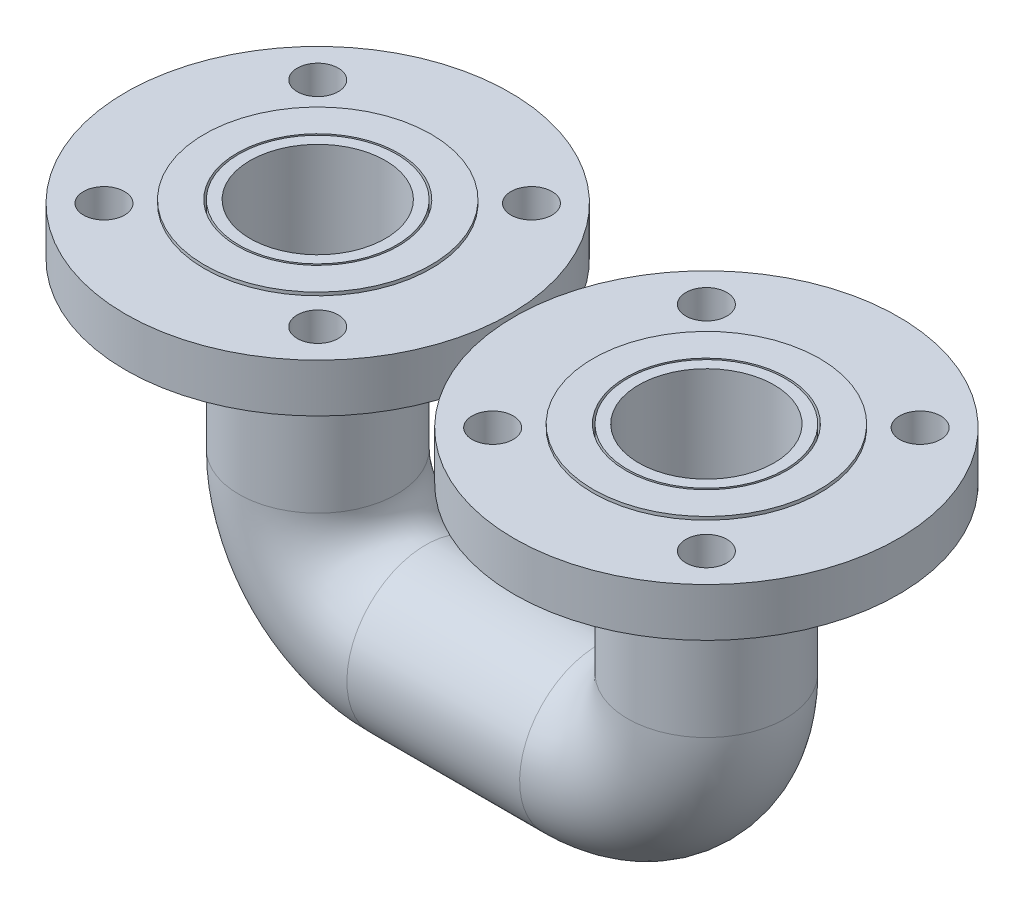
ISO-10303-21;
HEADER;
FILE_DESCRIPTION(('STEP AP214'),'2;1');
FILE_NAME('part.step','',(''),(''),'','','');
FILE_SCHEMA(('AUTOMOTIVE_DESIGN { 1 0 10303 214 1 1 1 1 }'));
ENDSEC;
DATA;
#1=APPLICATION_CONTEXT('core data for automotive mechanical design processes');
#2=APPLICATION_PROTOCOL_DEFINITION('international standard','automotive_design',2000,#1);
#3=PRODUCT_CONTEXT('',#1,'mechanical');
#4=PRODUCT('Part','Part','',(#3));
#5=PRODUCT_RELATED_PRODUCT_CATEGORY('part','',(#4));
#6=PRODUCT_DEFINITION_FORMATION('','',#4);
#7=PRODUCT_DEFINITION_CONTEXT('part definition',#1,'design');
#8=PRODUCT_DEFINITION('design','',#6,#7);
#9=PRODUCT_DEFINITION_SHAPE('','',#8);
#10=(LENGTH_UNIT() NAMED_UNIT(*) SI_UNIT(.MILLI.,.METRE.));
#11=(NAMED_UNIT(*) PLANE_ANGLE_UNIT() SI_UNIT($,.RADIAN.));
#12=(NAMED_UNIT(*) SI_UNIT($,.STERADIAN.) SOLID_ANGLE_UNIT());
#13=UNCERTAINTY_MEASURE_WITH_UNIT(LENGTH_MEASURE(1.E-05),#10,'distance_accuracy_value','');
#14=(GEOMETRIC_REPRESENTATION_CONTEXT(3) GLOBAL_UNCERTAINTY_ASSIGNED_CONTEXT((#13)) GLOBAL_UNIT_ASSIGNED_CONTEXT((#10,
#11,#12)) REPRESENTATION_CONTEXT('',''));
#15=CARTESIAN_POINT('',(0.,0.,0.));
#16=DIRECTION('',(0.,0.,1.));
#17=DIRECTION('',(1.,0.,0.));
#18=AXIS2_PLACEMENT_3D('',#15,#16,#17);
#19=CARTESIAN_POINT('',(180.,-76.1,0.));
#20=DIRECTION('',(0.,1.,0.));
#21=DIRECTION('',(0.,0.,1.));
#22=AXIS2_PLACEMENT_3D('',#19,#20,#21);
#23=CYLINDRICAL_SURFACE('',#22,36.5);
#24=CARTESIAN_POINT('',(180.,-76.1,0.));
#25=DIRECTION('',(0.,-1.,0.));
#26=DIRECTION('',(1.,0.,0.));
#27=AXIS2_PLACEMENT_3D('',#24,#25,#26);
#28=CIRCLE('',#27,36.5);
#29=CARTESIAN_POINT('',(216.5,-76.1,0.));
#30=VERTEX_POINT('',#29);
#31=EDGE_CURVE('E52',#30,#30,#28,.T.);
#32=ORIENTED_EDGE('',*,*,#31,.F.);
#33=EDGE_LOOP('',(#32));
#34=FACE_BOUND('',#33,.T.);
#35=CARTESIAN_POINT('',(180.,23.9,0.));
#36=DIRECTION('',(0.,-1.,0.));
#37=DIRECTION('',(1.,0.,0.));
#38=AXIS2_PLACEMENT_3D('',#35,#36,#37);
#39=CIRCLE('',#38,36.5);
#40=CARTESIAN_POINT('',(216.5,23.9,0.));
#41=VERTEX_POINT('',#40);
#42=EDGE_CURVE('E11',#41,#41,#39,.T.);
#43=ORIENTED_EDGE('',*,*,#42,.T.);
#44=EDGE_LOOP('',(#43));
#45=FACE_BOUND('',#44,.T.);
#46=ADVANCED_FACE('F42',(#34,#45),#23,.T.);
#47=CARTESIAN_POINT('',(180.,-76.1,0.));
#48=DIRECTION('',(0.,1.,0.));
#49=DIRECTION('',(0.,0.,1.));
#50=AXIS2_PLACEMENT_3D('',#47,#48,#49);
#51=CYLINDRICAL_SURFACE('',#50,31.34);
#52=CARTESIAN_POINT('',(180.,-76.1,0.));
#53=DIRECTION('',(0.,-1.,0.));
#54=DIRECTION('',(1.,0.,0.));
#55=AXIS2_PLACEMENT_3D('',#52,#53,#54);
#56=CIRCLE('',#55,31.34);
#57=CARTESIAN_POINT('',(211.34,-76.1,0.));
#58=VERTEX_POINT('',#57);
#59=EDGE_CURVE('E56',#58,#58,#56,.T.);
#60=ORIENTED_EDGE('',*,*,#59,.T.);
#61=EDGE_LOOP('',(#60));
#62=FACE_BOUND('',#61,.T.);
#63=CARTESIAN_POINT('',(180.,23.9,0.));
#64=DIRECTION('',(0.,-1.,0.));
#65=DIRECTION('',(1.,0.,0.));
#66=AXIS2_PLACEMENT_3D('',#63,#64,#65);
#67=CIRCLE('',#66,31.34);
#68=CARTESIAN_POINT('',(211.34,23.9,0.));
#69=VERTEX_POINT('',#68);
#70=EDGE_CURVE('E48',#69,#69,#67,.T.);
#71=ORIENTED_EDGE('',*,*,#70,.F.);
#72=EDGE_LOOP('',(#71));
#73=FACE_BOUND('',#72,.T.);
#74=ADVANCED_FACE('F111',(#62,#73),#51,.F.);
#75=CARTESIAN_POINT('',(130.,-76.1,0.));
#76=DIRECTION('',(0.,0.,1.));
#77=DIRECTION('',(1.,0.,0.));
#78=AXIS2_PLACEMENT_3D('',#75,#76,#77);
#79=TOROIDAL_SURFACE('',#78,50.,36.5);
#80=CARTESIAN_POINT('',(130.,-126.1,0.));
#81=DIRECTION('',(-1.,0.,0.));
#82=DIRECTION('',(0.,-1.,0.));
#83=AXIS2_PLACEMENT_3D('',#80,#81,#82);
#84=CIRCLE('',#83,36.5);
#85=CARTESIAN_POINT('',(130.,-162.6,0.));
#86=VERTEX_POINT('',#85);
#87=EDGE_CURVE('E61',#86,#86,#84,.T.);
#88=CARTESIAN_POINT('',(130.,-76.1,0.));
#89=DIRECTION('',(0.,0.,1.));
#90=DIRECTION('',(1.,0.,0.));
#91=AXIS2_PLACEMENT_3D('',#88,#89,#90);
#92=CIRCLE('',#91,86.5);
#93=EDGE_CURVE('',#86,#30,#92,.T.);
#94=ORIENTED_EDGE('',*,*,#87,.F.);
#95=ORIENTED_EDGE('',*,*,#31,.T.);
#96=ORIENTED_EDGE('',*,*,#93,.T.);
#97=ORIENTED_EDGE('',*,*,#93,.F.);
#98=EDGE_LOOP('',(#94,#96,#95,#97));
#99=FACE_BOUND('',#98,.T.);
#100=ADVANCED_FACE('F116',(#99),#79,.T.);
#101=CARTESIAN_POINT('',(130.,-76.1,0.));
#102=DIRECTION('',(0.,0.,1.));
#103=DIRECTION('',(1.,0.,0.));
#104=AXIS2_PLACEMENT_3D('',#101,#102,#103);
#105=TOROIDAL_SURFACE('',#104,50.,31.34);
#106=CARTESIAN_POINT('',(130.,-126.1,0.));
#107=DIRECTION('',(-1.,0.,0.));
#108=DIRECTION('',(0.,-1.,0.));
#109=AXIS2_PLACEMENT_3D('',#106,#107,#108);
#110=CIRCLE('',#109,31.34);
#111=CARTESIAN_POINT('',(130.,-157.44,0.));
#112=VERTEX_POINT('',#111);
#113=EDGE_CURVE('E64',#112,#112,#110,.T.);
#114=CARTESIAN_POINT('',(130.,-76.1,0.));
#115=DIRECTION('',(0.,0.,1.));
#116=DIRECTION('',(1.,0.,0.));
#117=AXIS2_PLACEMENT_3D('',#114,#115,#116);
#118=CIRCLE('',#117,81.34);
#119=EDGE_CURVE('',#112,#58,#118,.T.);
#120=ORIENTED_EDGE('',*,*,#113,.T.);
#121=ORIENTED_EDGE('',*,*,#59,.F.);
#122=ORIENTED_EDGE('',*,*,#119,.T.);
#123=ORIENTED_EDGE('',*,*,#119,.F.);
#124=EDGE_LOOP('',(#120,#122,#121,#123));
#125=FACE_BOUND('',#124,.T.);
#126=ADVANCED_FACE('F121',(#125),#105,.F.);
#127=CARTESIAN_POINT('',(50.,-126.1,0.));
#128=DIRECTION('',(1.,0.,0.));
#129=DIRECTION('',(0.,0.,-1.));
#130=AXIS2_PLACEMENT_3D('',#127,#128,#129);
#131=CYLINDRICAL_SURFACE('',#130,36.5);
#132=CARTESIAN_POINT('',(50.,-126.1,0.));
#133=DIRECTION('',(-1.,0.,0.));
#134=DIRECTION('',(0.,-1.,0.));
#135=AXIS2_PLACEMENT_3D('',#132,#133,#134);
#136=CIRCLE('',#135,36.5);
#137=CARTESIAN_POINT('',(50.,-162.6,0.));
#138=VERTEX_POINT('',#137);
#139=EDGE_CURVE('E67',#138,#138,#136,.T.);
#140=ORIENTED_EDGE('',*,*,#139,.F.);
#141=EDGE_LOOP('',(#140));
#142=FACE_BOUND('',#141,.T.);
#143=ORIENTED_EDGE('',*,*,#87,.T.);
#144=EDGE_LOOP('',(#143));
#145=FACE_BOUND('',#144,.T.);
#146=ADVANCED_FACE('F127',(#142,#145),#131,.T.);
#147=CARTESIAN_POINT('',(50.,-126.1,0.));
#148=DIRECTION('',(1.,0.,0.));
#149=DIRECTION('',(0.,0.,-1.));
#150=AXIS2_PLACEMENT_3D('',#147,#148,#149);
#151=CYLINDRICAL_SURFACE('',#150,31.34);
#152=CARTESIAN_POINT('',(50.,-126.1,0.));
#153=DIRECTION('',(-1.,0.,0.));
#154=DIRECTION('',(0.,-1.,0.));
#155=AXIS2_PLACEMENT_3D('',#152,#153,#154);
#156=CIRCLE('',#155,31.34);
#157=CARTESIAN_POINT('',(50.,-157.44,0.));
#158=VERTEX_POINT('',#157);
#159=EDGE_CURVE('E70',#158,#158,#156,.T.);
#160=ORIENTED_EDGE('',*,*,#159,.T.);
#161=EDGE_LOOP('',(#160));
#162=FACE_BOUND('',#161,.T.);
#163=ORIENTED_EDGE('',*,*,#113,.F.);
#164=EDGE_LOOP('',(#163));
#165=FACE_BOUND('',#164,.T.);
#166=ADVANCED_FACE('F134',(#162,#165),#151,.F.);
#167=CARTESIAN_POINT('',(50.,-76.1,0.));
#168=DIRECTION('',(0.,0.,1.));
#169=DIRECTION('',(1.,0.,0.));
#170=AXIS2_PLACEMENT_3D('',#167,#168,#169);
#171=TOROIDAL_SURFACE('',#170,50.,36.5);
#172=CARTESIAN_POINT('',(0.,-76.1,0.));
#173=DIRECTION('',(0.,1.,0.));
#174=DIRECTION('',(-1.,0.,0.));
#175=AXIS2_PLACEMENT_3D('',#172,#173,#174);
#176=CIRCLE('',#175,36.5);
#177=CARTESIAN_POINT('',(-36.5,-76.1,0.));
#178=VERTEX_POINT('',#177);
#179=EDGE_CURVE('E73',#178,#178,#176,.T.);
#180=CARTESIAN_POINT('',(50.,-76.1,0.));
#181=DIRECTION('',(0.,0.,1.));
#182=DIRECTION('',(1.,0.,0.));
#183=AXIS2_PLACEMENT_3D('',#180,#181,#182);
#184=CIRCLE('',#183,86.5);
#185=EDGE_CURVE('',#178,#138,#184,.T.);
#186=ORIENTED_EDGE('',*,*,#179,.F.);
#187=ORIENTED_EDGE('',*,*,#139,.T.);
#188=ORIENTED_EDGE('',*,*,#185,.T.);
#189=ORIENTED_EDGE('',*,*,#185,.F.);
#190=EDGE_LOOP('',(#186,#188,#187,#189));
#191=FACE_BOUND('',#190,.T.);
#192=ADVANCED_FACE('F138',(#191),#171,.T.);
#193=CARTESIAN_POINT('',(50.,-76.1,0.));
#194=DIRECTION('',(0.,0.,1.));
#195=DIRECTION('',(1.,0.,0.));
#196=AXIS2_PLACEMENT_3D('',#193,#194,#195);
#197=TOROIDAL_SURFACE('',#196,50.,31.34);
#198=CARTESIAN_POINT('',(0.,-76.1,0.));
#199=DIRECTION('',(0.,1.,0.));
#200=DIRECTION('',(-1.,0.,0.));
#201=AXIS2_PLACEMENT_3D('',#198,#199,#200);
#202=CIRCLE('',#201,31.34);
#203=CARTESIAN_POINT('',(-31.34,-76.1,0.));
#204=VERTEX_POINT('',#203);
#205=EDGE_CURVE('E77',#204,#204,#202,.T.);
#206=CARTESIAN_POINT('',(50.,-76.1,0.));
#207=DIRECTION('',(0.,0.,1.));
#208=DIRECTION('',(1.,0.,0.));
#209=AXIS2_PLACEMENT_3D('',#206,#207,#208);
#210=CIRCLE('',#209,81.34);
#211=EDGE_CURVE('',#204,#158,#210,.T.);
#212=ORIENTED_EDGE('',*,*,#205,.T.);
#213=ORIENTED_EDGE('',*,*,#159,.F.);
#214=ORIENTED_EDGE('',*,*,#211,.T.);
#215=ORIENTED_EDGE('',*,*,#211,.F.);
#216=EDGE_LOOP('',(#212,#214,#213,#215));
#217=FACE_BOUND('',#216,.T.);
#218=ADVANCED_FACE('F86',(#217),#197,.F.);
#219=CARTESIAN_POINT('',(0.,-76.1,0.));
#220=DIRECTION('',(0.,1.,0.));
#221=DIRECTION('',(0.,0.,1.));
#222=AXIS2_PLACEMENT_3D('',#219,#220,#221);
#223=CYLINDRICAL_SURFACE('',#222,31.34);
#224=ORIENTED_EDGE('',*,*,#205,.F.);
#225=EDGE_LOOP('',(#224));
#226=FACE_BOUND('',#225,.T.);
#227=CARTESIAN_POINT('',(0.,23.9,0.));
#228=DIRECTION('',(0.,1.,0.));
#229=DIRECTION('',(-1.,0.,0.));
#230=AXIS2_PLACEMENT_3D('',#227,#228,#229);
#231=CIRCLE('',#230,31.34);
#232=CARTESIAN_POINT('',(-31.34,23.9,0.));
#233=VERTEX_POINT('',#232);
#234=EDGE_CURVE('E78',#233,#233,#231,.T.);
#235=ORIENTED_EDGE('',*,*,#234,.T.);
#236=EDGE_LOOP('',(#235));
#237=FACE_BOUND('',#236,.T.);
#238=ADVANCED_FACE('F89',(#226,#237),#223,.F.);
#239=CARTESIAN_POINT('',(0.,-76.1,0.));
#240=DIRECTION('',(0.,1.,0.));
#241=DIRECTION('',(0.,0.,1.));
#242=AXIS2_PLACEMENT_3D('',#239,#240,#241);
#243=CYLINDRICAL_SURFACE('',#242,36.5);
#244=ORIENTED_EDGE('',*,*,#179,.T.);
#245=EDGE_LOOP('',(#244));
#246=FACE_BOUND('',#245,.T.);
#247=CARTESIAN_POINT('',(0.,23.9,0.));
#248=DIRECTION('',(0.,1.,0.));
#249=DIRECTION('',(-1.,0.,0.));
#250=AXIS2_PLACEMENT_3D('',#247,#248,#249);
#251=CIRCLE('',#250,36.5);
#252=CARTESIAN_POINT('',(-36.5,23.9,0.));
#253=VERTEX_POINT('',#252);
#254=EDGE_CURVE('E74',#253,#253,#251,.T.);
#255=ORIENTED_EDGE('',*,*,#254,.F.);
#256=EDGE_LOOP('',(#255));
#257=FACE_BOUND('',#256,.T.);
#258=ADVANCED_FACE('F92',(#246,#257),#243,.T.);
#259=CARTESIAN_POINT('',(180.,23.9,0.));
#260=DIRECTION('',(0.,-1.,0.));
#261=DIRECTION('',(1.,0.,0.));
#262=AXIS2_PLACEMENT_3D('',#259,#260,#261);
#263=PLANE('',#262);
#264=ORIENTED_EDGE('',*,*,#70,.T.);
#265=EDGE_LOOP('',(#264));
#266=FACE_BOUND('',#265,.T.);
#267=ORIENTED_EDGE('',*,*,#42,.F.);
#268=EDGE_LOOP('',(#267));
#269=FACE_BOUND('',#268,.T.);
#270=ADVANCED_FACE('F99',(#266,#269),#263,.F.);
#271=CARTESIAN_POINT('',(0.,23.9,0.));
#272=DIRECTION('',(0.,1.,0.));
#273=DIRECTION('',(-1.,0.,0.));
#274=AXIS2_PLACEMENT_3D('',#271,#272,#273);
#275=PLANE('',#274);
#276=ORIENTED_EDGE('',*,*,#234,.F.);
#277=EDGE_LOOP('',(#276));
#278=FACE_BOUND('',#277,.T.);
#279=ORIENTED_EDGE('',*,*,#254,.T.);
#280=EDGE_LOOP('',(#279));
#281=FACE_BOUND('',#280,.T.);
#282=ADVANCED_FACE('F96',(#278,#281),#275,.T.);
#283=CLOSED_SHELL('',(#46,#74,#100,#126,#146,#166,#192,#218,#238,#258,#270,#282));
#284=MANIFOLD_SOLID_BREP('B2',#283);
#285=CARTESIAN_POINT('',(180.,22.4,0.));
#286=DIRECTION('',(0.,1.,0.));
#287=DIRECTION('',(0.,0.,1.));
#288=AXIS2_PLACEMENT_3D('',#285,#286,#287);
#289=PLANE('',#288);
#290=CARTESIAN_POINT('',(130.502525316942,22.4,-49.4974746830582));
#291=DIRECTION('',(0.,-1.,0.));
#292=DIRECTION('',(0.,0.,-1.));
#293=AXIS2_PLACEMENT_3D('',#290,#291,#292);
#294=CIRCLE('',#293,9.5);
#295=CARTESIAN_POINT('',(130.502525316942,22.4,-58.9974746830582));
#296=VERTEX_POINT('',#295);
#297=EDGE_CURVE('E262',#296,#296,#294,.T.);
#298=ORIENTED_EDGE('',*,*,#297,.T.);
#299=EDGE_LOOP('',(#298));
#300=FACE_BOUND('',#299,.T.);
#301=CARTESIAN_POINT('',(229.497474683058,22.4,49.4974746830582));
#302=DIRECTION('',(0.,-1.,0.));
#303=DIRECTION('',(0.,0.,-1.));
#304=AXIS2_PLACEMENT_3D('',#301,#302,#303);
#305=CIRCLE('',#304,9.5);
#306=CARTESIAN_POINT('',(229.497474683058,22.4,39.9974746830582));
#307=VERTEX_POINT('',#306);
#308=EDGE_CURVE('E250',#307,#307,#305,.T.);
#309=ORIENTED_EDGE('',*,*,#308,.T.);
#310=EDGE_LOOP('',(#309));
#311=FACE_BOUND('',#310,.T.);
#312=CARTESIAN_POINT('',(180.,22.4,0.));
#313=DIRECTION('',(0.,-1.,0.));
#314=DIRECTION('',(0.,0.,1.));
#315=AXIS2_PLACEMENT_3D('',#312,#313,#314);
#316=CIRCLE('',#315,89.);
#317=CARTESIAN_POINT('',(180.,22.4,89.));
#318=VERTEX_POINT('',#317);
#319=EDGE_CURVE('E41',#318,#318,#316,.T.);
#320=ORIENTED_EDGE('',*,*,#319,.F.);
#321=EDGE_LOOP('',(#320));
#322=FACE_BOUND('',#321,.T.);
#323=CARTESIAN_POINT('',(229.497474683058,22.4,-49.4974746830582));
#324=DIRECTION('',(0.,-1.,0.));
#325=DIRECTION('',(0.,0.,1.));
#326=AXIS2_PLACEMENT_3D('',#323,#324,#325);
#327=CIRCLE('',#326,9.5);
#328=CARTESIAN_POINT('',(229.497474683058,22.4,-39.9974746830582));
#329=VERTEX_POINT('',#328);
#330=EDGE_CURVE('E246',#329,#329,#327,.T.);
#331=ORIENTED_EDGE('',*,*,#330,.T.);
#332=EDGE_LOOP('',(#331));
#333=FACE_BOUND('',#332,.T.);
#334=CARTESIAN_POINT('',(130.502525316942,22.4,49.4974746830582));
#335=DIRECTION('',(0.,-1.,0.));
#336=DIRECTION('',(0.,0.,1.));
#337=AXIS2_PLACEMENT_3D('',#334,#335,#336);
#338=CIRCLE('',#337,9.5);
#339=CARTESIAN_POINT('',(130.502525316942,22.4,58.9974746830582));
#340=VERTEX_POINT('',#339);
#341=EDGE_CURVE('E256',#340,#340,#338,.T.);
#342=ORIENTED_EDGE('',*,*,#341,.T.);
#343=EDGE_LOOP('',(#342));
#344=FACE_BOUND('',#343,.T.);
#345=CARTESIAN_POINT('',(180.,22.4,0.));
#346=DIRECTION('',(0.,-1.,0.));
#347=DIRECTION('',(0.,0.,1.));
#348=AXIS2_PLACEMENT_3D('',#345,#346,#347);
#349=CIRCLE('',#348,52.5);
#350=CARTESIAN_POINT('',(180.,22.4,52.5));
#351=VERTEX_POINT('',#350);
#352=EDGE_CURVE('E271',#351,#351,#349,.T.);
#353=ORIENTED_EDGE('',*,*,#352,.T.);
#354=EDGE_LOOP('',(#353));
#355=FACE_BOUND('',#354,.T.);
#356=ADVANCED_FACE('F231',(#300,#311,#322,#333,#344,#355),#289,.T.);
#357=CARTESIAN_POINT('',(180.,0.,0.));
#358=DIRECTION('',(0.,1.,0.));
#359=DIRECTION('',(0.,0.,1.));
#360=AXIS2_PLACEMENT_3D('',#357,#358,#359);
#361=PLANE('',#360);
#362=CARTESIAN_POINT('',(180.,0.,0.));
#363=DIRECTION('',(0.,-1.,0.));
#364=DIRECTION('',(0.,0.,1.));
#365=AXIS2_PLACEMENT_3D('',#362,#363,#364);
#366=CIRCLE('',#365,89.);
#367=CARTESIAN_POINT('',(180.,0.,89.));
#368=VERTEX_POINT('',#367);
#369=EDGE_CURVE('E235',#368,#368,#366,.T.);
#370=ORIENTED_EDGE('',*,*,#369,.T.);
#371=EDGE_LOOP('',(#370));
#372=FACE_BOUND('',#371,.T.);
#373=CARTESIAN_POINT('',(180.,0.,0.));
#374=DIRECTION('',(0.,-1.,0.));
#375=DIRECTION('',(0.,0.,1.));
#376=AXIS2_PLACEMENT_3D('',#373,#374,#375);
#377=CIRCLE('',#376,37.35);
#378=CARTESIAN_POINT('',(180.,0.,37.35));
#379=VERTEX_POINT('',#378);
#380=EDGE_CURVE('E242',#379,#379,#377,.T.);
#381=ORIENTED_EDGE('',*,*,#380,.F.);
#382=EDGE_LOOP('',(#381));
#383=FACE_BOUND('',#382,.T.);
#384=CARTESIAN_POINT('',(229.497474683058,0.,-49.4974746830582));
#385=DIRECTION('',(0.,-1.,0.));
#386=DIRECTION('',(0.,0.,1.));
#387=AXIS2_PLACEMENT_3D('',#384,#385,#386);
#388=CIRCLE('',#387,9.5);
#389=CARTESIAN_POINT('',(229.497474683058,0.,-39.9974746830582));
#390=VERTEX_POINT('',#389);
#391=EDGE_CURVE('E247',#390,#390,#388,.T.);
#392=ORIENTED_EDGE('',*,*,#391,.F.);
#393=EDGE_LOOP('',(#392));
#394=FACE_BOUND('',#393,.T.);
#395=CARTESIAN_POINT('',(229.497474683058,0.,49.4974746830582));
#396=DIRECTION('',(0.,-1.,0.));
#397=DIRECTION('',(0.,0.,-1.));
#398=AXIS2_PLACEMENT_3D('',#395,#396,#397);
#399=CIRCLE('',#398,9.5);
#400=CARTESIAN_POINT('',(229.497474683058,0.,39.9974746830582));
#401=VERTEX_POINT('',#400);
#402=EDGE_CURVE('E253',#401,#401,#399,.T.);
#403=ORIENTED_EDGE('',*,*,#402,.F.);
#404=EDGE_LOOP('',(#403));
#405=FACE_BOUND('',#404,.T.);
#406=CARTESIAN_POINT('',(130.502525316942,0.,49.4974746830582));
#407=DIRECTION('',(0.,-1.,0.));
#408=DIRECTION('',(0.,0.,1.));
#409=AXIS2_PLACEMENT_3D('',#406,#407,#408);
#410=CIRCLE('',#409,9.5);
#411=CARTESIAN_POINT('',(130.502525316942,0.,58.9974746830582));
#412=VERTEX_POINT('',#411);
#413=EDGE_CURVE('E259',#412,#412,#410,.T.);
#414=ORIENTED_EDGE('',*,*,#413,.F.);
#415=EDGE_LOOP('',(#414));
#416=FACE_BOUND('',#415,.T.);
#417=CARTESIAN_POINT('',(130.502525316942,0.,-49.4974746830582));
#418=DIRECTION('',(0.,-1.,0.));
#419=DIRECTION('',(0.,0.,-1.));
#420=AXIS2_PLACEMENT_3D('',#417,#418,#419);
#421=CIRCLE('',#420,9.5);
#422=CARTESIAN_POINT('',(130.502525316942,0.,-58.9974746830582));
#423=VERTEX_POINT('',#422);
#424=EDGE_CURVE('E265',#423,#423,#421,.T.);
#425=ORIENTED_EDGE('',*,*,#424,.F.);
#426=EDGE_LOOP('',(#425));
#427=FACE_BOUND('',#426,.T.);
#428=ADVANCED_FACE('F294',(#372,#383,#394,#405,#416,#427),#361,.F.);
#429=CARTESIAN_POINT('',(180.,22.4,0.));
#430=DIRECTION('',(0.,-1.,0.));
#431=DIRECTION('',(0.,0.,-1.));
#432=AXIS2_PLACEMENT_3D('',#429,#430,#431);
#433=CYLINDRICAL_SURFACE('',#432,89.);
#434=ORIENTED_EDGE('',*,*,#319,.T.);
#435=EDGE_LOOP('',(#434));
#436=FACE_BOUND('',#435,.T.);
#437=ORIENTED_EDGE('',*,*,#369,.F.);
#438=EDGE_LOOP('',(#437));
#439=FACE_BOUND('',#438,.T.);
#440=ADVANCED_FACE('F233',(#436,#439),#433,.T.);
#441=CARTESIAN_POINT('',(180.,22.4,0.));
#442=DIRECTION('',(0.,-1.,0.));
#443=DIRECTION('',(0.,0.,-1.));
#444=AXIS2_PLACEMENT_3D('',#441,#442,#443);
#445=CYLINDRICAL_SURFACE('',#444,37.35);
#446=ORIENTED_EDGE('',*,*,#380,.T.);
#447=EDGE_LOOP('',(#446));
#448=FACE_BOUND('',#447,.T.);
#449=CARTESIAN_POINT('',(180.,23.9,0.));
#450=DIRECTION('',(0.,-1.,0.));
#451=DIRECTION('',(0.,0.,1.));
#452=AXIS2_PLACEMENT_3D('',#449,#450,#451);
#453=CIRCLE('',#452,37.35);
#454=CARTESIAN_POINT('',(180.,23.9,37.35));
#455=VERTEX_POINT('',#454);
#456=EDGE_CURVE('E274',#455,#455,#453,.T.);
#457=ORIENTED_EDGE('',*,*,#456,.F.);
#458=EDGE_LOOP('',(#457));
#459=FACE_BOUND('',#458,.T.);
#460=ADVANCED_FACE('F282',(#448,#459),#445,.F.);
#461=CARTESIAN_POINT('',(229.497474683058,22.4,-49.4974746830582));
#462=DIRECTION('',(0.,-1.,0.));
#463=DIRECTION('',(0.,0.,-1.));
#464=AXIS2_PLACEMENT_3D('',#461,#462,#463);
#465=CYLINDRICAL_SURFACE('',#464,9.5);
#466=ORIENTED_EDGE('',*,*,#330,.F.);
#467=EDGE_LOOP('',(#466));
#468=FACE_BOUND('',#467,.T.);
#469=ORIENTED_EDGE('',*,*,#391,.T.);
#470=EDGE_LOOP('',(#469));
#471=FACE_BOUND('',#470,.T.);
#472=ADVANCED_FACE('F284',(#468,#471),#465,.F.);
#473=CARTESIAN_POINT('',(229.497474683058,22.4,49.4974746830582));
#474=DIRECTION('',(0.,-1.,0.));
#475=DIRECTION('',(0.,0.,-1.));
#476=AXIS2_PLACEMENT_3D('',#473,#474,#475);
#477=CYLINDRICAL_SURFACE('',#476,9.5);
#478=ORIENTED_EDGE('',*,*,#308,.F.);
#479=EDGE_LOOP('',(#478));
#480=FACE_BOUND('',#479,.T.);
#481=ORIENTED_EDGE('',*,*,#402,.T.);
#482=EDGE_LOOP('',(#481));
#483=FACE_BOUND('',#482,.T.);
#484=ADVANCED_FACE('F291',(#480,#483),#477,.F.);
#485=CARTESIAN_POINT('',(130.502525316942,22.4,49.4974746830582));
#486=DIRECTION('',(0.,-1.,0.));
#487=DIRECTION('',(0.,0.,-1.));
#488=AXIS2_PLACEMENT_3D('',#485,#486,#487);
#489=CYLINDRICAL_SURFACE('',#488,9.5);
#490=ORIENTED_EDGE('',*,*,#341,.F.);
#491=EDGE_LOOP('',(#490));
#492=FACE_BOUND('',#491,.T.);
#493=ORIENTED_EDGE('',*,*,#413,.T.);
#494=EDGE_LOOP('',(#493));
#495=FACE_BOUND('',#494,.T.);
#496=ADVANCED_FACE('F326',(#492,#495),#489,.F.);
#497=CARTESIAN_POINT('',(130.502525316942,22.4,-49.4974746830582));
#498=DIRECTION('',(0.,-1.,0.));
#499=DIRECTION('',(0.,0.,-1.));
#500=AXIS2_PLACEMENT_3D('',#497,#498,#499);
#501=CYLINDRICAL_SURFACE('',#500,9.5);
#502=ORIENTED_EDGE('',*,*,#297,.F.);
#503=EDGE_LOOP('',(#502));
#504=FACE_BOUND('',#503,.T.);
#505=ORIENTED_EDGE('',*,*,#424,.T.);
#506=EDGE_LOOP('',(#505));
#507=FACE_BOUND('',#506,.T.);
#508=ADVANCED_FACE('F320',(#504,#507),#501,.F.);
#509=CARTESIAN_POINT('',(180.,23.9,0.));
#510=DIRECTION('',(0.,1.,0.));
#511=DIRECTION('',(0.,0.,1.));
#512=AXIS2_PLACEMENT_3D('',#509,#510,#511);
#513=PLANE('',#512);
#514=CARTESIAN_POINT('',(180.,23.9,0.));
#515=DIRECTION('',(0.,-1.,0.));
#516=DIRECTION('',(0.,0.,1.));
#517=AXIS2_PLACEMENT_3D('',#514,#515,#516);
#518=CIRCLE('',#517,52.5);
#519=CARTESIAN_POINT('',(180.,23.9,52.5));
#520=VERTEX_POINT('',#519);
#521=EDGE_CURVE('E268',#520,#520,#518,.T.);
#522=ORIENTED_EDGE('',*,*,#521,.F.);
#523=EDGE_LOOP('',(#522));
#524=FACE_BOUND('',#523,.T.);
#525=ORIENTED_EDGE('',*,*,#456,.T.);
#526=EDGE_LOOP('',(#525));
#527=FACE_BOUND('',#526,.T.);
#528=ADVANCED_FACE('F280',(#524,#527),#513,.T.);
#529=CARTESIAN_POINT('',(180.,23.9,0.));
#530=DIRECTION('',(0.,-1.,0.));
#531=DIRECTION('',(0.,0.,-1.));
#532=AXIS2_PLACEMENT_3D('',#529,#530,#531);
#533=CYLINDRICAL_SURFACE('',#532,52.5);
#534=ORIENTED_EDGE('',*,*,#521,.T.);
#535=EDGE_LOOP('',(#534));
#536=FACE_BOUND('',#535,.T.);
#537=ORIENTED_EDGE('',*,*,#352,.F.);
#538=EDGE_LOOP('',(#537));
#539=FACE_BOUND('',#538,.T.);
#540=ADVANCED_FACE('F313',(#536,#539),#533,.T.);
#541=CLOSED_SHELL('',(#356,#428,#440,#460,#472,#484,#496,#508,#528,#540));
#542=MANIFOLD_SOLID_BREP('B6',#541);
#543=CARTESIAN_POINT('',(0.,22.4,0.));
#544=DIRECTION('',(0.,1.,0.));
#545=DIRECTION('',(0.,0.,1.));
#546=AXIS2_PLACEMENT_3D('',#543,#544,#545);
#547=PLANE('',#546);
#548=CARTESIAN_POINT('',(49.4974746830584,22.4,-49.4974746830582));
#549=DIRECTION('',(0.,1.,0.));
#550=DIRECTION('',(0.,0.,-1.));
#551=AXIS2_PLACEMENT_3D('',#548,#549,#550);
#552=CIRCLE('',#551,9.5);
#553=CARTESIAN_POINT('',(49.4974746830584,22.4,-58.9974746830582));
#554=VERTEX_POINT('',#553);
#555=EDGE_CURVE('E441',#554,#554,#552,.T.);
#556=ORIENTED_EDGE('',*,*,#555,.F.);
#557=EDGE_LOOP('',(#556));
#558=FACE_BOUND('',#557,.T.);
#559=CARTESIAN_POINT('',(-49.4974746830584,22.4,49.4974746830582));
#560=DIRECTION('',(0.,1.,0.));
#561=DIRECTION('',(0.,0.,-1.));
#562=AXIS2_PLACEMENT_3D('',#559,#560,#561);
#563=CIRCLE('',#562,9.5);
#564=CARTESIAN_POINT('',(-49.4974746830584,22.4,39.9974746830582));
#565=VERTEX_POINT('',#564);
#566=EDGE_CURVE('E429',#565,#565,#563,.T.);
#567=ORIENTED_EDGE('',*,*,#566,.F.);
#568=EDGE_LOOP('',(#567));
#569=FACE_BOUND('',#568,.T.);
#570=CARTESIAN_POINT('',(0.,22.4,0.));
#571=DIRECTION('',(0.,1.,0.));
#572=DIRECTION('',(0.,0.,1.));
#573=AXIS2_PLACEMENT_3D('',#570,#571,#572);
#574=CIRCLE('',#573,89.);
#575=CARTESIAN_POINT('',(0.,22.4,89.));
#576=VERTEX_POINT('',#575);
#577=EDGE_CURVE('E230',#576,#576,#574,.T.);
#578=ORIENTED_EDGE('',*,*,#577,.T.);
#579=EDGE_LOOP('',(#578));
#580=FACE_BOUND('',#579,.T.);
#581=CARTESIAN_POINT('',(-49.4974746830584,22.4,-49.4974746830582));
#582=DIRECTION('',(0.,1.,0.));
#583=DIRECTION('',(0.,0.,1.));
#584=AXIS2_PLACEMENT_3D('',#581,#582,#583);
#585=CIRCLE('',#584,9.5);
#586=CARTESIAN_POINT('',(-49.4974746830584,22.4,-39.9974746830582));
#587=VERTEX_POINT('',#586);
#588=EDGE_CURVE('E425',#587,#587,#585,.T.);
#589=ORIENTED_EDGE('',*,*,#588,.F.);
#590=EDGE_LOOP('',(#589));
#591=FACE_BOUND('',#590,.T.);
#592=CARTESIAN_POINT('',(49.4974746830584,22.4,49.4974746830582));
#593=DIRECTION('',(0.,1.,0.));
#594=DIRECTION('',(0.,0.,1.));
#595=AXIS2_PLACEMENT_3D('',#592,#593,#594);
#596=CIRCLE('',#595,9.5);
#597=CARTESIAN_POINT('',(49.4974746830584,22.4,58.9974746830582));
#598=VERTEX_POINT('',#597);
#599=EDGE_CURVE('E435',#598,#598,#596,.T.);
#600=ORIENTED_EDGE('',*,*,#599,.F.);
#601=EDGE_LOOP('',(#600));
#602=FACE_BOUND('',#601,.T.);
#603=CARTESIAN_POINT('',(0.,22.4,0.));
#604=DIRECTION('',(0.,1.,0.));
#605=DIRECTION('',(0.,0.,1.));
#606=AXIS2_PLACEMENT_3D('',#603,#604,#605);
#607=CIRCLE('',#606,52.5);
#608=CARTESIAN_POINT('',(0.,22.4,52.5));
#609=VERTEX_POINT('',#608);
#610=EDGE_CURVE('E450',#609,#609,#607,.T.);
#611=ORIENTED_EDGE('',*,*,#610,.F.);
#612=EDGE_LOOP('',(#611));
#613=FACE_BOUND('',#612,.T.);
#614=ADVANCED_FACE('F410',(#558,#569,#580,#591,#602,#613),#547,.T.);
#615=CARTESIAN_POINT('',(0.,0.,0.));
#616=DIRECTION('',(0.,1.,0.));
#617=DIRECTION('',(0.,0.,1.));
#618=AXIS2_PLACEMENT_3D('',#615,#616,#617);
#619=PLANE('',#618);
#620=CARTESIAN_POINT('',(0.,0.,0.));
#621=DIRECTION('',(0.,1.,0.));
#622=DIRECTION('',(0.,0.,1.));
#623=AXIS2_PLACEMENT_3D('',#620,#621,#622);
#624=CIRCLE('',#623,89.);
#625=CARTESIAN_POINT('',(0.,0.,89.));
#626=VERTEX_POINT('',#625);
#627=EDGE_CURVE('E414',#626,#626,#624,.T.);
#628=ORIENTED_EDGE('',*,*,#627,.F.);
#629=EDGE_LOOP('',(#628));
#630=FACE_BOUND('',#629,.T.);
#631=CARTESIAN_POINT('',(0.,0.,0.));
#632=DIRECTION('',(0.,1.,0.));
#633=DIRECTION('',(0.,0.,1.));
#634=AXIS2_PLACEMENT_3D('',#631,#632,#633);
#635=CIRCLE('',#634,37.35);
#636=CARTESIAN_POINT('',(0.,0.,37.35));
#637=VERTEX_POINT('',#636);
#638=EDGE_CURVE('E421',#637,#637,#635,.T.);
#639=ORIENTED_EDGE('',*,*,#638,.T.);
#640=EDGE_LOOP('',(#639));
#641=FACE_BOUND('',#640,.T.);
#642=CARTESIAN_POINT('',(-49.4974746830584,0.,-49.4974746830582));
#643=DIRECTION('',(0.,1.,0.));
#644=DIRECTION('',(0.,0.,1.));
#645=AXIS2_PLACEMENT_3D('',#642,#643,#644);
#646=CIRCLE('',#645,9.5);
#647=CARTESIAN_POINT('',(-49.4974746830584,0.,-39.9974746830582));
#648=VERTEX_POINT('',#647);
#649=EDGE_CURVE('E426',#648,#648,#646,.T.);
#650=ORIENTED_EDGE('',*,*,#649,.T.);
#651=EDGE_LOOP('',(#650));
#652=FACE_BOUND('',#651,.T.);
#653=CARTESIAN_POINT('',(-49.4974746830584,0.,49.4974746830582));
#654=DIRECTION('',(0.,1.,0.));
#655=DIRECTION('',(0.,0.,-1.));
#656=AXIS2_PLACEMENT_3D('',#653,#654,#655);
#657=CIRCLE('',#656,9.5);
#658=CARTESIAN_POINT('',(-49.4974746830584,0.,39.9974746830582));
#659=VERTEX_POINT('',#658);
#660=EDGE_CURVE('E432',#659,#659,#657,.T.);
#661=ORIENTED_EDGE('',*,*,#660,.T.);
#662=EDGE_LOOP('',(#661));
#663=FACE_BOUND('',#662,.T.);
#664=CARTESIAN_POINT('',(49.4974746830584,0.,49.4974746830582));
#665=DIRECTION('',(0.,1.,0.));
#666=DIRECTION('',(0.,0.,1.));
#667=AXIS2_PLACEMENT_3D('',#664,#665,#666);
#668=CIRCLE('',#667,9.5);
#669=CARTESIAN_POINT('',(49.4974746830584,0.,58.9974746830582));
#670=VERTEX_POINT('',#669);
#671=EDGE_CURVE('E438',#670,#670,#668,.T.);
#672=ORIENTED_EDGE('',*,*,#671,.T.);
#673=EDGE_LOOP('',(#672));
#674=FACE_BOUND('',#673,.T.);
#675=CARTESIAN_POINT('',(49.4974746830584,0.,-49.4974746830582));
#676=DIRECTION('',(0.,1.,0.));
#677=DIRECTION('',(0.,0.,-1.));
#678=AXIS2_PLACEMENT_3D('',#675,#676,#677);
#679=CIRCLE('',#678,9.5);
#680=CARTESIAN_POINT('',(49.4974746830584,0.,-58.9974746830582));
#681=VERTEX_POINT('',#680);
#682=EDGE_CURVE('E444',#681,#681,#679,.T.);
#683=ORIENTED_EDGE('',*,*,#682,.T.);
#684=EDGE_LOOP('',(#683));
#685=FACE_BOUND('',#684,.T.);
#686=ADVANCED_FACE('F477',(#630,#641,#652,#663,#674,#685),#619,.F.);
#687=CARTESIAN_POINT('',(0.,22.4,0.));
#688=DIRECTION('',(0.,-1.,0.));
#689=DIRECTION('',(0.,0.,-1.));
#690=AXIS2_PLACEMENT_3D('',#687,#688,#689);
#691=CYLINDRICAL_SURFACE('',#690,89.);
#692=ORIENTED_EDGE('',*,*,#577,.F.);
#693=EDGE_LOOP('',(#692));
#694=FACE_BOUND('',#693,.T.);
#695=ORIENTED_EDGE('',*,*,#627,.T.);
#696=EDGE_LOOP('',(#695));
#697=FACE_BOUND('',#696,.T.);
#698=ADVANCED_FACE('F412',(#694,#697),#691,.T.);
#699=CARTESIAN_POINT('',(0.,22.4,0.));
#700=DIRECTION('',(0.,-1.,0.));
#701=DIRECTION('',(0.,0.,-1.));
#702=AXIS2_PLACEMENT_3D('',#699,#700,#701);
#703=CYLINDRICAL_SURFACE('',#702,37.35);
#704=ORIENTED_EDGE('',*,*,#638,.F.);
#705=EDGE_LOOP('',(#704));
#706=FACE_BOUND('',#705,.T.);
#707=CARTESIAN_POINT('',(0.,23.9,0.));
#708=DIRECTION('',(0.,1.,0.));
#709=DIRECTION('',(0.,0.,1.));
#710=AXIS2_PLACEMENT_3D('',#707,#708,#709);
#711=CIRCLE('',#710,37.35);
#712=CARTESIAN_POINT('',(0.,23.9,37.35));
#713=VERTEX_POINT('',#712);
#714=EDGE_CURVE('E453',#713,#713,#711,.T.);
#715=ORIENTED_EDGE('',*,*,#714,.T.);
#716=EDGE_LOOP('',(#715));
#717=FACE_BOUND('',#716,.T.);
#718=ADVANCED_FACE('F459',(#706,#717),#703,.F.);
#719=CARTESIAN_POINT('',(-49.4974746830584,22.4,-49.4974746830582));
#720=DIRECTION('',(0.,-1.,0.));
#721=DIRECTION('',(0.,0.,-1.));
#722=AXIS2_PLACEMENT_3D('',#719,#720,#721);
#723=CYLINDRICAL_SURFACE('',#722,9.5);
#724=ORIENTED_EDGE('',*,*,#588,.T.);
#725=EDGE_LOOP('',(#724));
#726=FACE_BOUND('',#725,.T.);
#727=ORIENTED_EDGE('',*,*,#649,.F.);
#728=EDGE_LOOP('',(#727));
#729=FACE_BOUND('',#728,.T.);
#730=ADVANCED_FACE('F489',(#726,#729),#723,.F.);
#731=CARTESIAN_POINT('',(-49.4974746830584,22.4,49.4974746830582));
#732=DIRECTION('',(0.,-1.,0.));
#733=DIRECTION('',(0.,0.,-1.));
#734=AXIS2_PLACEMENT_3D('',#731,#732,#733);
#735=CYLINDRICAL_SURFACE('',#734,9.5);
#736=ORIENTED_EDGE('',*,*,#566,.T.);
#737=EDGE_LOOP('',(#736));
#738=FACE_BOUND('',#737,.T.);
#739=ORIENTED_EDGE('',*,*,#660,.F.);
#740=EDGE_LOOP('',(#739));
#741=FACE_BOUND('',#740,.T.);
#742=ADVANCED_FACE('F493',(#738,#741),#735,.F.);
#743=CARTESIAN_POINT('',(49.4974746830584,22.4,49.4974746830582));
#744=DIRECTION('',(0.,-1.,0.));
#745=DIRECTION('',(0.,0.,-1.));
#746=AXIS2_PLACEMENT_3D('',#743,#744,#745);
#747=CYLINDRICAL_SURFACE('',#746,9.5);
#748=ORIENTED_EDGE('',*,*,#599,.T.);
#749=EDGE_LOOP('',(#748));
#750=FACE_BOUND('',#749,.T.);
#751=ORIENTED_EDGE('',*,*,#671,.F.);
#752=EDGE_LOOP('',(#751));
#753=FACE_BOUND('',#752,.T.);
#754=ADVANCED_FACE('F473',(#750,#753),#747,.F.);
#755=CARTESIAN_POINT('',(49.4974746830584,22.4,-49.4974746830582));
#756=DIRECTION('',(0.,-1.,0.));
#757=DIRECTION('',(0.,0.,-1.));
#758=AXIS2_PLACEMENT_3D('',#755,#756,#757);
#759=CYLINDRICAL_SURFACE('',#758,9.5);
#760=ORIENTED_EDGE('',*,*,#555,.T.);
#761=EDGE_LOOP('',(#760));
#762=FACE_BOUND('',#761,.T.);
#763=ORIENTED_EDGE('',*,*,#682,.F.);
#764=EDGE_LOOP('',(#763));
#765=FACE_BOUND('',#764,.T.);
#766=ADVANCED_FACE('F464',(#762,#765),#759,.F.);
#767=CARTESIAN_POINT('',(0.,23.9,0.));
#768=DIRECTION('',(0.,1.,0.));
#769=DIRECTION('',(0.,0.,1.));
#770=AXIS2_PLACEMENT_3D('',#767,#768,#769);
#771=PLANE('',#770);
#772=CARTESIAN_POINT('',(0.,23.9,0.));
#773=DIRECTION('',(0.,1.,0.));
#774=DIRECTION('',(0.,0.,1.));
#775=AXIS2_PLACEMENT_3D('',#772,#773,#774);
#776=CIRCLE('',#775,52.5);
#777=CARTESIAN_POINT('',(0.,23.9,52.5));
#778=VERTEX_POINT('',#777);
#779=EDGE_CURVE('E447',#778,#778,#776,.T.);
#780=ORIENTED_EDGE('',*,*,#779,.T.);
#781=EDGE_LOOP('',(#780));
#782=FACE_BOUND('',#781,.T.);
#783=ORIENTED_EDGE('',*,*,#714,.F.);
#784=EDGE_LOOP('',(#783));
#785=FACE_BOUND('',#784,.T.);
#786=ADVANCED_FACE('F461',(#782,#785),#771,.T.);
#787=CARTESIAN_POINT('',(0.,23.9,0.));
#788=DIRECTION('',(0.,-1.,0.));
#789=DIRECTION('',(0.,0.,-1.));
#790=AXIS2_PLACEMENT_3D('',#787,#788,#789);
#791=CYLINDRICAL_SURFACE('',#790,52.5);
#792=ORIENTED_EDGE('',*,*,#779,.F.);
#793=EDGE_LOOP('',(#792));
#794=FACE_BOUND('',#793,.T.);
#795=ORIENTED_EDGE('',*,*,#610,.T.);
#796=EDGE_LOOP('',(#795));
#797=FACE_BOUND('',#796,.T.);
#798=ADVANCED_FACE('F463',(#794,#797),#791,.T.);
#799=CLOSED_SHELL('',(#614,#686,#698,#718,#730,#742,#754,#766,#786,#798));
#800=MANIFOLD_SOLID_BREP('B36',#799);
#801=ADVANCED_BREP_SHAPE_REPRESENTATION('',(#18,#284,#542,#800),#14);
#802=SHAPE_DEFINITION_REPRESENTATION(#9,#801);
ENDSEC;
END-ISO-10303-21;
